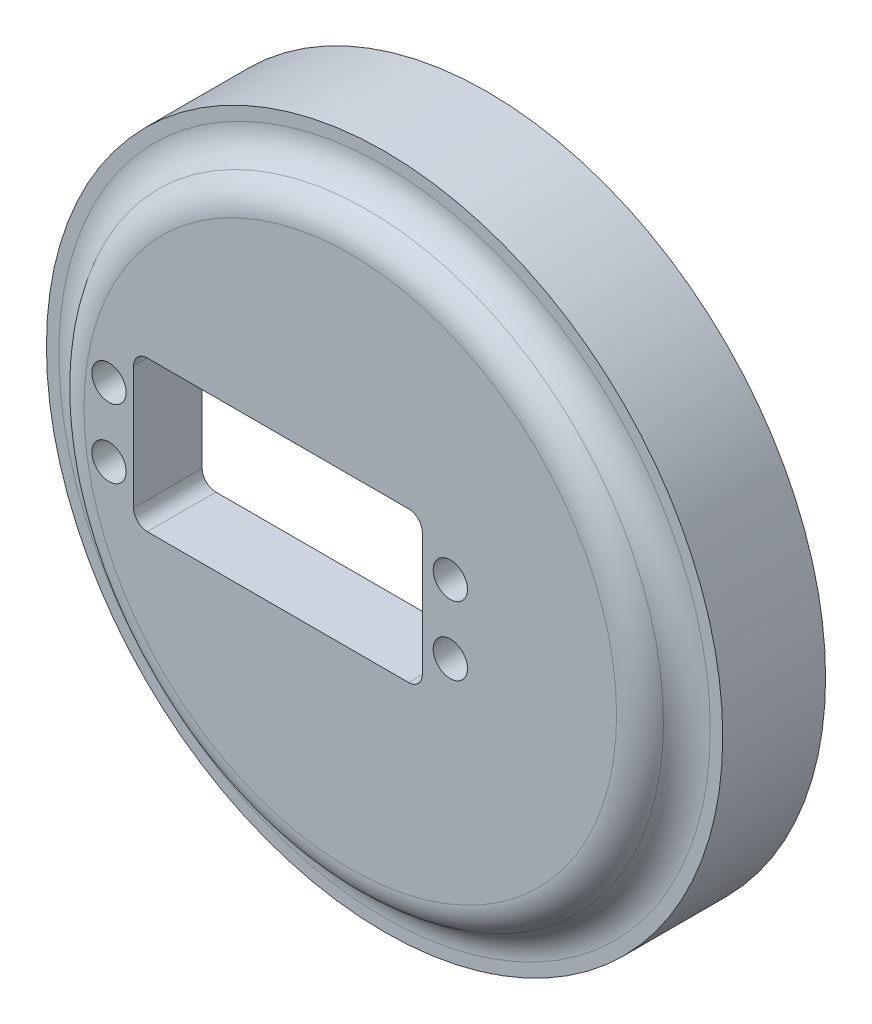
ISO-10303-21;
HEADER;
FILE_DESCRIPTION(('STEP AP214'),'2;1');
FILE_NAME('part.step','',(''),(''),'','','');
FILE_SCHEMA(('AUTOMOTIVE_DESIGN { 1 0 10303 214 1 1 1 1 }'));
ENDSEC;
DATA;
#1=APPLICATION_CONTEXT('core data for automotive mechanical design processes');
#2=APPLICATION_PROTOCOL_DEFINITION('international standard','automotive_design',2000,#1);
#3=PRODUCT_CONTEXT('',#1,'mechanical');
#4=PRODUCT('Part','Part','',(#3));
#5=PRODUCT_RELATED_PRODUCT_CATEGORY('part','',(#4));
#6=PRODUCT_DEFINITION_FORMATION('','',#4);
#7=PRODUCT_DEFINITION_CONTEXT('part definition',#1,'design');
#8=PRODUCT_DEFINITION('design','',#6,#7);
#9=PRODUCT_DEFINITION_SHAPE('','',#8);
#10=(LENGTH_UNIT() NAMED_UNIT(*) SI_UNIT(.MILLI.,.METRE.));
#11=(NAMED_UNIT(*) PLANE_ANGLE_UNIT() SI_UNIT($,.RADIAN.));
#12=(NAMED_UNIT(*) SI_UNIT($,.STERADIAN.) SOLID_ANGLE_UNIT());
#13=UNCERTAINTY_MEASURE_WITH_UNIT(LENGTH_MEASURE(1.E-05),#10,'distance_accuracy_value','');
#14=(GEOMETRIC_REPRESENTATION_CONTEXT(3) GLOBAL_UNCERTAINTY_ASSIGNED_CONTEXT((#13)) GLOBAL_UNIT_ASSIGNED_CONTEXT((#10,
#11,#12)) REPRESENTATION_CONTEXT('',''));
#15=CARTESIAN_POINT('',(0.,0.,0.));
#16=DIRECTION('',(0.,0.,1.));
#17=DIRECTION('',(1.,0.,0.));
#18=AXIS2_PLACEMENT_3D('',#15,#16,#17);
#19=CARTESIAN_POINT('',(0.,0.,0.));
#20=DIRECTION('',(0.,0.,1.));
#21=DIRECTION('',(1.,0.,0.));
#22=AXIS2_PLACEMENT_3D('',#19,#20,#21);
#23=PLANE('',#22);
#24=CARTESIAN_POINT('',(0.,0.,0.));
#25=DIRECTION('',(0.,0.,1.));
#26=DIRECTION('',(1.,0.,0.));
#27=AXIS2_PLACEMENT_3D('',#24,#25,#26);
#28=CIRCLE('',#27,49.32);
#29=CARTESIAN_POINT('',(49.32,0.,0.));
#30=VERTEX_POINT('',#29);
#31=EDGE_CURVE('E155',#30,#30,#28,.T.);
#32=ORIENTED_EDGE('',*,*,#31,.F.);
#33=EDGE_LOOP('',(#32));
#34=FACE_BOUND('',#33,.T.);
#35=CARTESIAN_POINT('',(0.,0.,0.));
#36=DIRECTION('',(0.,0.,1.));
#37=DIRECTION('',(1.,0.,0.));
#38=AXIS2_PLACEMENT_3D('',#35,#36,#37);
#39=CIRCLE('',#38,46.32);
#40=CARTESIAN_POINT('',(46.32,0.,0.));
#41=VERTEX_POINT('',#40);
#42=EDGE_CURVE('E152',#41,#41,#39,.T.);
#43=ORIENTED_EDGE('',*,*,#42,.T.);
#44=EDGE_LOOP('',(#43));
#45=FACE_BOUND('',#44,.T.);
#46=ADVANCED_FACE('F39',(#34,#45),#23,.F.);
#47=CARTESIAN_POINT('',(0.,0.,10.));
#48=DIRECTION('',(0.,0.,-1.));
#49=DIRECTION('',(-1.,0.,0.));
#50=AXIS2_PLACEMENT_3D('',#47,#48,#49);
#51=CYLINDRICAL_SURFACE('',#50,49.32);
#52=ORIENTED_EDGE('',*,*,#31,.T.);
#53=EDGE_LOOP('',(#52));
#54=FACE_BOUND('',#53,.T.);
#55=CARTESIAN_POINT('',(0.,0.,15.));
#56=DIRECTION('',(0.,0.,1.));
#57=DIRECTION('',(1.,0.,0.));
#58=AXIS2_PLACEMENT_3D('',#55,#56,#57);
#59=CIRCLE('',#58,49.32);
#60=CARTESIAN_POINT('',(49.32,0.,15.));
#61=VERTEX_POINT('',#60);
#62=EDGE_CURVE('E149',#61,#61,#59,.T.);
#63=ORIENTED_EDGE('',*,*,#62,.F.);
#64=EDGE_LOOP('',(#63));
#65=FACE_BOUND('',#64,.T.);
#66=ADVANCED_FACE('F224',(#54,#65),#51,.T.);
#67=CARTESIAN_POINT('',(0.,0.,10.));
#68=DIRECTION('',(0.,0.,-1.));
#69=DIRECTION('',(-1.,0.,0.));
#70=AXIS2_PLACEMENT_3D('',#67,#68,#69);
#71=CYLINDRICAL_SURFACE('',#70,46.32);
#72=CARTESIAN_POINT('',(0.,0.,5.));
#73=DIRECTION('',(0.,0.,1.));
#74=DIRECTION('',(1.,0.,0.));
#75=AXIS2_PLACEMENT_3D('',#72,#73,#74);
#76=CIRCLE('',#75,46.32);
#77=CARTESIAN_POINT('',(46.32,0.,5.));
#78=VERTEX_POINT('',#77);
#79=EDGE_CURVE('E161',#78,#78,#76,.T.);
#80=ORIENTED_EDGE('',*,*,#79,.T.);
#81=EDGE_LOOP('',(#80));
#82=FACE_BOUND('',#81,.T.);
#83=ORIENTED_EDGE('',*,*,#42,.F.);
#84=EDGE_LOOP('',(#83));
#85=FACE_BOUND('',#84,.T.);
#86=ADVANCED_FACE('F230',(#82,#85),#71,.F.);
#87=CARTESIAN_POINT('',(0.,0.,10.));
#88=DIRECTION('',(0.,0.,1.));
#89=DIRECTION('',(1.,0.,0.));
#90=AXIS2_PLACEMENT_3D('',#87,#88,#89);
#91=PLANE('',#90);
#92=CARTESIAN_POINT('',(-35.1896133009766,4.99999999999999,10.));
#93=DIRECTION('',(0.,0.,1.));
#94=DIRECTION('',(1.,0.,0.));
#95=AXIS2_PLACEMENT_3D('',#92,#93,#94);
#96=CIRCLE('',#95,2.5);
#97=CARTESIAN_POINT('',(-32.6896133009766,4.99999999999999,10.));
#98=VERTEX_POINT('',#97);
#99=EDGE_CURVE('E134',#98,#98,#96,.T.);
#100=ORIENTED_EDGE('',*,*,#99,.T.);
#101=EDGE_LOOP('',(#100));
#102=FACE_BOUND('',#101,.T.);
#103=CARTESIAN_POINT('',(-35.1896133009766,-5.00000000000001,10.));
#104=DIRECTION('',(0.,0.,1.));
#105=DIRECTION('',(1.,0.,0.));
#106=AXIS2_PLACEMENT_3D('',#103,#104,#105);
#107=CIRCLE('',#106,2.5);
#108=CARTESIAN_POINT('',(-32.6896133009766,-5.00000000000001,10.));
#109=VERTEX_POINT('',#108);
#110=EDGE_CURVE('E282',#109,#109,#107,.T.);
#111=ORIENTED_EDGE('',*,*,#110,.T.);
#112=EDGE_LOOP('',(#111));
#113=FACE_BOUND('',#112,.T.);
#114=CARTESIAN_POINT('',(14.5896133009771,5.00000000000001,10.));
#115=DIRECTION('',(0.,0.,1.));
#116=DIRECTION('',(1.,0.,0.));
#117=AXIS2_PLACEMENT_3D('',#114,#115,#116);
#118=CIRCLE('',#117,2.5);
#119=CARTESIAN_POINT('',(17.0896133009771,5.00000000000001,10.));
#120=VERTEX_POINT('',#119);
#121=EDGE_CURVE('E286',#120,#120,#118,.T.);
#122=ORIENTED_EDGE('',*,*,#121,.T.);
#123=EDGE_LOOP('',(#122));
#124=FACE_BOUND('',#123,.T.);
#125=CARTESIAN_POINT('',(14.5896133009771,-4.99999999999999,10.));
#126=DIRECTION('',(0.,0.,1.));
#127=DIRECTION('',(1.,0.,0.));
#128=AXIS2_PLACEMENT_3D('',#125,#126,#127);
#129=CIRCLE('',#128,2.5);
#130=CARTESIAN_POINT('',(17.0896133009771,-4.99999999999999,10.));
#131=VERTEX_POINT('',#130);
#132=EDGE_CURVE('E289',#131,#131,#129,.T.);
#133=ORIENTED_EDGE('',*,*,#132,.T.);
#134=EDGE_LOOP('',(#133));
#135=FACE_BOUND('',#134,.T.);
#136=DIRECTION('',(0.,-1.,0.));
#137=VECTOR('',#136,1.);
#138=CARTESIAN_POINT('',(-31.5999999999998,0.,10.));
#139=LINE('',#138,#137);
#140=CARTESIAN_POINT('',(-31.5999999999998,8.90000000000001,10.));
#141=VERTEX_POINT('',#140);
#142=CARTESIAN_POINT('',(-31.5999999999998,-9.03482478055817,10.));
#143=VERTEX_POINT('',#142);
#144=EDGE_CURVE('E141',#141,#143,#139,.T.);
#145=ORIENTED_EDGE('',*,*,#144,.T.);
#146=CARTESIAN_POINT('',(-29.5999999999998,-9.03482478055817,10.));
#147=DIRECTION('',(0.,0.,1.));
#148=DIRECTION('',(1.,0.,0.));
#149=AXIS2_PLACEMENT_3D('',#146,#147,#148);
#150=CIRCLE('',#149,2.);
#151=CARTESIAN_POINT('',(-29.5999999999998,-11.0348247805582,10.));
#152=VERTEX_POINT('',#151);
#153=EDGE_CURVE('E193',#143,#152,#150,.T.);
#154=ORIENTED_EDGE('',*,*,#153,.T.);
#155=DIRECTION('',(1.,0.,0.));
#156=VECTOR('',#155,1.);
#157=CARTESIAN_POINT('',(0.,-11.0348247805582,10.));
#158=LINE('',#157,#156);
#159=CARTESIAN_POINT('',(8.50000000000025,-11.0348247805582,10.));
#160=VERTEX_POINT('',#159);
#161=EDGE_CURVE('E143',#152,#160,#158,.T.);
#162=ORIENTED_EDGE('',*,*,#161,.T.);
#163=CARTESIAN_POINT('',(8.50000000000025,-9.03482478055817,10.));
#164=DIRECTION('',(0.,0.,1.));
#165=DIRECTION('',(1.,0.,0.));
#166=AXIS2_PLACEMENT_3D('',#163,#164,#165);
#167=CIRCLE('',#166,2.);
#168=CARTESIAN_POINT('',(10.5000000000002,-9.03482478055817,10.));
#169=VERTEX_POINT('',#168);
#170=EDGE_CURVE('E189',#160,#169,#167,.T.);
#171=ORIENTED_EDGE('',*,*,#170,.T.);
#172=DIRECTION('',(0.,1.,0.));
#173=VECTOR('',#172,1.);
#174=CARTESIAN_POINT('',(10.5000000000002,0.,10.));
#175=LINE('',#174,#173);
#176=CARTESIAN_POINT('',(10.5000000000002,8.90000000000001,10.));
#177=VERTEX_POINT('',#176);
#178=EDGE_CURVE('E146',#169,#177,#175,.T.);
#179=ORIENTED_EDGE('',*,*,#178,.T.);
#180=CARTESIAN_POINT('',(8.50000000000024,8.90000000000001,10.));
#181=DIRECTION('',(0.,0.,1.));
#182=DIRECTION('',(1.,0.,0.));
#183=AXIS2_PLACEMENT_3D('',#180,#181,#182);
#184=CIRCLE('',#183,2.);
#185=CARTESIAN_POINT('',(8.50000000000024,10.9,10.));
#186=VERTEX_POINT('',#185);
#187=EDGE_CURVE('E114',#177,#186,#184,.T.);
#188=ORIENTED_EDGE('',*,*,#187,.T.);
#189=DIRECTION('',(-1.,0.,0.));
#190=VECTOR('',#189,1.);
#191=CARTESIAN_POINT('',(0.,10.9,10.));
#192=LINE('',#191,#190);
#193=CARTESIAN_POINT('',(-29.5999999999998,10.9,10.));
#194=VERTEX_POINT('',#193);
#195=EDGE_CURVE('E122',#186,#194,#192,.T.);
#196=ORIENTED_EDGE('',*,*,#195,.T.);
#197=CARTESIAN_POINT('',(-29.5999999999998,8.90000000000001,10.));
#198=DIRECTION('',(0.,0.,1.));
#199=DIRECTION('',(1.,0.,0.));
#200=AXIS2_PLACEMENT_3D('',#197,#198,#199);
#201=CIRCLE('',#200,2.);
#202=EDGE_CURVE('E12',#194,#141,#201,.T.);
#203=ORIENTED_EDGE('',*,*,#202,.T.);
#204=EDGE_LOOP('',(#145,#154,#162,#171,#179,#188,#196,#203));
#205=FACE_BOUND('',#204,.T.);
#206=CARTESIAN_POINT('',(0.,0.,10.));
#207=DIRECTION('',(0.,0.,1.));
#208=DIRECTION('',(1.,0.,0.));
#209=AXIS2_PLACEMENT_3D('',#206,#207,#208);
#210=CIRCLE('',#209,41.32);
#211=CARTESIAN_POINT('',(41.32,0.,10.));
#212=VERTEX_POINT('',#211);
#213=EDGE_CURVE('E164',#212,#212,#210,.F.);
#214=ORIENTED_EDGE('',*,*,#213,.T.);
#215=EDGE_LOOP('',(#214));
#216=FACE_BOUND('',#215,.T.);
#217=ADVANCED_FACE('F196',(#102,#113,#124,#135,#205,#216),#91,.F.);
#218=CARTESIAN_POINT('',(0.,0.,15.));
#219=DIRECTION('',(0.,0.,1.));
#220=DIRECTION('',(1.,0.,0.));
#221=AXIS2_PLACEMENT_3D('',#218,#219,#220);
#222=PLANE('',#221);
#223=CARTESIAN_POINT('',(0.,0.,15.));
#224=DIRECTION('',(0.,0.,1.));
#225=DIRECTION('',(1.,0.,0.));
#226=AXIS2_PLACEMENT_3D('',#223,#224,#225);
#227=CIRCLE('',#226,47.5);
#228=CARTESIAN_POINT('',(47.5,0.,15.));
#229=VERTEX_POINT('',#228);
#230=EDGE_CURVE('E158',#229,#229,#227,.F.);
#231=ORIENTED_EDGE('',*,*,#230,.T.);
#232=EDGE_LOOP('',(#231));
#233=FACE_BOUND('',#232,.T.);
#234=ORIENTED_EDGE('',*,*,#62,.T.);
#235=EDGE_LOOP('',(#234));
#236=FACE_BOUND('',#235,.T.);
#237=ADVANCED_FACE('F257',(#233,#236),#222,.T.);
#238=CARTESIAN_POINT('',(0.,0.,20.));
#239=DIRECTION('',(0.,0.,1.));
#240=DIRECTION('',(1.,0.,0.));
#241=AXIS2_PLACEMENT_3D('',#238,#239,#240);
#242=PLANE('',#241);
#243=CARTESIAN_POINT('',(-35.1896133009766,4.99999999999999,20.));
#244=DIRECTION('',(0.,0.,1.));
#245=DIRECTION('',(1.,0.,0.));
#246=AXIS2_PLACEMENT_3D('',#243,#244,#245);
#247=CIRCLE('',#246,2.5);
#248=CARTESIAN_POINT('',(-32.6896133009766,4.99999999999999,20.));
#249=VERTEX_POINT('',#248);
#250=EDGE_CURVE('E291',#249,#249,#247,.T.);
#251=ORIENTED_EDGE('',*,*,#250,.F.);
#252=EDGE_LOOP('',(#251));
#253=FACE_BOUND('',#252,.T.);
#254=CARTESIAN_POINT('',(-35.1896133009766,-5.00000000000001,20.));
#255=DIRECTION('',(0.,0.,1.));
#256=DIRECTION('',(1.,0.,0.));
#257=AXIS2_PLACEMENT_3D('',#254,#255,#256);
#258=CIRCLE('',#257,2.5);
#259=CARTESIAN_POINT('',(-32.6896133009766,-5.00000000000001,20.));
#260=VERTEX_POINT('',#259);
#261=EDGE_CURVE('E295',#260,#260,#258,.T.);
#262=ORIENTED_EDGE('',*,*,#261,.F.);
#263=EDGE_LOOP('',(#262));
#264=FACE_BOUND('',#263,.T.);
#265=CARTESIAN_POINT('',(14.5896133009771,5.00000000000001,20.));
#266=DIRECTION('',(0.,0.,1.));
#267=DIRECTION('',(1.,0.,0.));
#268=AXIS2_PLACEMENT_3D('',#265,#266,#267);
#269=CIRCLE('',#268,2.5);
#270=CARTESIAN_POINT('',(17.0896133009771,5.00000000000001,20.));
#271=VERTEX_POINT('',#270);
#272=EDGE_CURVE('E302',#271,#271,#269,.T.);
#273=ORIENTED_EDGE('',*,*,#272,.F.);
#274=EDGE_LOOP('',(#273));
#275=FACE_BOUND('',#274,.T.);
#276=CARTESIAN_POINT('',(14.5896133009771,-4.99999999999999,20.));
#277=DIRECTION('',(0.,0.,1.));
#278=DIRECTION('',(1.,0.,0.));
#279=AXIS2_PLACEMENT_3D('',#276,#277,#278);
#280=CIRCLE('',#279,2.5);
#281=CARTESIAN_POINT('',(17.0896133009771,-4.99999999999999,20.));
#282=VERTEX_POINT('',#281);
#283=EDGE_CURVE('E298',#282,#282,#280,.T.);
#284=ORIENTED_EDGE('',*,*,#283,.F.);
#285=EDGE_LOOP('',(#284));
#286=FACE_BOUND('',#285,.T.);
#287=DIRECTION('',(0.,1.,0.));
#288=VECTOR('',#287,1.);
#289=CARTESIAN_POINT('',(10.5000000000002,10.9,20.));
#290=LINE('',#289,#288);
#291=CARTESIAN_POINT('',(10.5000000000002,-9.03482478055816,20.));
#292=VERTEX_POINT('',#291);
#293=CARTESIAN_POINT('',(10.5000000000002,8.90000000000001,20.));
#294=VERTEX_POINT('',#293);
#295=EDGE_CURVE('E130',#292,#294,#290,.T.);
#296=ORIENTED_EDGE('',*,*,#295,.F.);
#297=CARTESIAN_POINT('',(8.50000000000025,-9.03482478055817,20.));
#298=DIRECTION('',(0.,0.,1.));
#299=DIRECTION('',(1.,0.,0.));
#300=AXIS2_PLACEMENT_3D('',#297,#298,#299);
#301=CIRCLE('',#300,2.);
#302=CARTESIAN_POINT('',(8.50000000000024,-11.0348247805582,20.));
#303=VERTEX_POINT('',#302);
#304=EDGE_CURVE('E187',#292,#303,#301,.F.);
#305=ORIENTED_EDGE('',*,*,#304,.T.);
#306=DIRECTION('',(1.,0.,0.));
#307=VECTOR('',#306,1.);
#308=CARTESIAN_POINT('',(-31.5999999999998,-11.0348247805582,20.));
#309=LINE('',#308,#307);
#310=CARTESIAN_POINT('',(-29.5999999999998,-11.0348247805582,20.));
#311=VERTEX_POINT('',#310);
#312=EDGE_CURVE('E132',#311,#303,#309,.T.);
#313=ORIENTED_EDGE('',*,*,#312,.F.);
#314=CARTESIAN_POINT('',(-29.5999999999998,-9.03482478055817,20.));
#315=DIRECTION('',(0.,0.,1.));
#316=DIRECTION('',(1.,0.,0.));
#317=AXIS2_PLACEMENT_3D('',#314,#315,#316);
#318=CIRCLE('',#317,2.);
#319=CARTESIAN_POINT('',(-31.5999999999998,-9.03482478055816,20.));
#320=VERTEX_POINT('',#319);
#321=EDGE_CURVE('E191',#311,#320,#318,.F.);
#322=ORIENTED_EDGE('',*,*,#321,.T.);
#323=DIRECTION('',(0.,-1.,0.));
#324=VECTOR('',#323,1.);
#325=CARTESIAN_POINT('',(-31.5999999999998,10.9,20.));
#326=LINE('',#325,#324);
#327=CARTESIAN_POINT('',(-31.5999999999998,8.90000000000001,20.));
#328=VERTEX_POINT('',#327);
#329=EDGE_CURVE('E129',#328,#320,#326,.T.);
#330=ORIENTED_EDGE('',*,*,#329,.F.);
#331=CARTESIAN_POINT('',(-29.5999999999998,8.90000000000001,20.));
#332=DIRECTION('',(0.,0.,1.));
#333=DIRECTION('',(1.,0.,0.));
#334=AXIS2_PLACEMENT_3D('',#331,#332,#333);
#335=CIRCLE('',#334,2.);
#336=CARTESIAN_POINT('',(-29.5999999999998,10.9,20.));
#337=VERTEX_POINT('',#336);
#338=EDGE_CURVE('E47',#328,#337,#335,.F.);
#339=ORIENTED_EDGE('',*,*,#338,.T.);
#340=DIRECTION('',(-1.,0.,0.));
#341=VECTOR('',#340,1.);
#342=CARTESIAN_POINT('',(-31.5999999999998,10.9,20.));
#343=LINE('',#342,#341);
#344=CARTESIAN_POINT('',(8.50000000000024,10.9,20.));
#345=VERTEX_POINT('',#344);
#346=EDGE_CURVE('E120',#345,#337,#343,.T.);
#347=ORIENTED_EDGE('',*,*,#346,.F.);
#348=CARTESIAN_POINT('',(8.50000000000024,8.90000000000001,20.));
#349=DIRECTION('',(0.,0.,1.));
#350=DIRECTION('',(1.,0.,0.));
#351=AXIS2_PLACEMENT_3D('',#348,#349,#350);
#352=CIRCLE('',#351,2.);
#353=EDGE_CURVE('E104',#345,#294,#352,.F.);
#354=ORIENTED_EDGE('',*,*,#353,.T.);
#355=EDGE_LOOP('',(#296,#305,#313,#322,#330,#339,#347,#354));
#356=FACE_BOUND('',#355,.T.);
#357=CARTESIAN_POINT('',(0.,0.,20.));
#358=DIRECTION('',(0.,0.,1.));
#359=DIRECTION('',(1.,0.,0.));
#360=AXIS2_PLACEMENT_3D('',#357,#358,#359);
#361=CIRCLE('',#360,38.8397459621556);
#362=CARTESIAN_POINT('',(38.8397459621556,0.,20.));
#363=VERTEX_POINT('',#362);
#364=EDGE_CURVE('E167',#363,#363,#361,.T.);
#365=ORIENTED_EDGE('',*,*,#364,.T.);
#366=EDGE_LOOP('',(#365));
#367=FACE_BOUND('',#366,.T.);
#368=ADVANCED_FACE('F126',(#253,#264,#275,#286,#356,#367),#242,.T.);
#369=CARTESIAN_POINT('',(0.,0.,20.));
#370=DIRECTION('',(0.,0.,1.));
#371=DIRECTION('',(1.,0.,0.));
#372=AXIS2_PLACEMENT_3D('',#369,#370,#371);
#373=TOROIDAL_SURFACE('',#372,47.5,5.);
#374=CARTESIAN_POINT('',(0.,0.,17.5));
#375=DIRECTION('',(0.,0.,1.));
#376=DIRECTION('',(1.,0.,0.));
#377=AXIS2_PLACEMENT_3D('',#374,#375,#376);
#378=CIRCLE('',#377,43.1698729810778);
#379=CARTESIAN_POINT('',(43.1698729810778,0.,17.5));
#380=VERTEX_POINT('',#379);
#381=EDGE_CURVE('E170',#380,#380,#378,.F.);
#382=ORIENTED_EDGE('',*,*,#381,.T.);
#383=EDGE_LOOP('',(#382));
#384=FACE_BOUND('',#383,.T.);
#385=ORIENTED_EDGE('',*,*,#230,.F.);
#386=EDGE_LOOP('',(#385));
#387=FACE_BOUND('',#386,.T.);
#388=ADVANCED_FACE('F238',(#384,#387),#373,.F.);
#389=CARTESIAN_POINT('',(0.,0.,5.));
#390=DIRECTION('',(0.,0.,1.));
#391=DIRECTION('',(1.,0.,0.));
#392=AXIS2_PLACEMENT_3D('',#389,#390,#391);
#393=TOROIDAL_SURFACE('',#392,41.32,5.);
#394=ORIENTED_EDGE('',*,*,#213,.F.);
#395=EDGE_LOOP('',(#394));
#396=FACE_BOUND('',#395,.T.);
#397=ORIENTED_EDGE('',*,*,#79,.F.);
#398=EDGE_LOOP('',(#397));
#399=FACE_BOUND('',#398,.T.);
#400=ADVANCED_FACE('F241',(#396,#399),#393,.F.);
#401=CARTESIAN_POINT('',(0.,0.,15.));
#402=DIRECTION('',(0.,0.,-1.));
#403=DIRECTION('',(-1.,0.,0.));
#404=AXIS2_PLACEMENT_3D('',#401,#402,#403);
#405=TOROIDAL_SURFACE('',#404,38.8397459621556,5.);
#406=ORIENTED_EDGE('',*,*,#381,.F.);
#407=EDGE_LOOP('',(#406));
#408=FACE_BOUND('',#407,.T.);
#409=ORIENTED_EDGE('',*,*,#364,.F.);
#410=EDGE_LOOP('',(#409));
#411=FACE_BOUND('',#410,.T.);
#412=ADVANCED_FACE('F245',(#408,#411),#405,.T.);
#413=CARTESIAN_POINT('',(10.5000000000002,10.9,0.));
#414=DIRECTION('',(1.,0.,0.));
#415=DIRECTION('',(0.,0.,-1.));
#416=AXIS2_PLACEMENT_3D('',#413,#414,#415);
#417=PLANE('',#416);
#418=ORIENTED_EDGE('',*,*,#295,.T.);
#419=DIRECTION('',(0.,0.,1.));
#420=VECTOR('',#419,1.);
#421=CARTESIAN_POINT('',(10.5000000000002,8.90000000000001,10.));
#422=LINE('',#421,#420);
#423=EDGE_CURVE('E109',#294,#177,#422,.F.);
#424=ORIENTED_EDGE('',*,*,#423,.T.);
#425=ORIENTED_EDGE('',*,*,#178,.F.);
#426=DIRECTION('',(0.,0.,1.));
#427=VECTOR('',#426,1.);
#428=CARTESIAN_POINT('',(10.5000000000002,-9.03482478055817,20.));
#429=LINE('',#428,#427);
#430=EDGE_CURVE('E123',#169,#292,#429,.T.);
#431=ORIENTED_EDGE('',*,*,#430,.T.);
#432=EDGE_LOOP('',(#418,#424,#425,#431));
#433=FACE_BOUND('',#432,.T.);
#434=ADVANCED_FACE('F212',(#433),#417,.F.);
#435=CARTESIAN_POINT('',(-31.5999999999998,-11.0348247805582,0.));
#436=DIRECTION('',(0.,-1.,0.));
#437=DIRECTION('',(0.,0.,-1.));
#438=AXIS2_PLACEMENT_3D('',#435,#436,#437);
#439=PLANE('',#438);
#440=ORIENTED_EDGE('',*,*,#312,.T.);
#441=DIRECTION('',(0.,0.,1.));
#442=VECTOR('',#441,1.);
#443=CARTESIAN_POINT('',(8.50000000000025,-11.0348247805582,10.));
#444=LINE('',#443,#442);
#445=EDGE_CURVE('E180',#303,#160,#444,.F.);
#446=ORIENTED_EDGE('',*,*,#445,.T.);
#447=ORIENTED_EDGE('',*,*,#161,.F.);
#448=DIRECTION('',(0.,0.,1.));
#449=VECTOR('',#448,1.);
#450=CARTESIAN_POINT('',(-29.5999999999998,-11.0348247805582,20.));
#451=LINE('',#450,#449);
#452=EDGE_CURVE('E177',#152,#311,#451,.T.);
#453=ORIENTED_EDGE('',*,*,#452,.T.);
#454=EDGE_LOOP('',(#440,#446,#447,#453));
#455=FACE_BOUND('',#454,.T.);
#456=ADVANCED_FACE('F202',(#455),#439,.F.);
#457=CARTESIAN_POINT('',(-31.5999999999998,10.9,0.));
#458=DIRECTION('',(-1.,0.,0.));
#459=DIRECTION('',(0.,0.,1.));
#460=AXIS2_PLACEMENT_3D('',#457,#458,#459);
#461=PLANE('',#460);
#462=ORIENTED_EDGE('',*,*,#329,.T.);
#463=DIRECTION('',(0.,0.,1.));
#464=VECTOR('',#463,1.);
#465=CARTESIAN_POINT('',(-31.5999999999998,-9.03482478055817,10.));
#466=LINE('',#465,#464);
#467=EDGE_CURVE('E54',#320,#143,#466,.F.);
#468=ORIENTED_EDGE('',*,*,#467,.T.);
#469=ORIENTED_EDGE('',*,*,#144,.F.);
#470=DIRECTION('',(0.,0.,1.));
#471=VECTOR('',#470,1.);
#472=CARTESIAN_POINT('',(-31.5999999999998,8.90000000000001,20.));
#473=LINE('',#472,#471);
#474=EDGE_CURVE('E182',#141,#328,#473,.T.);
#475=ORIENTED_EDGE('',*,*,#474,.T.);
#476=EDGE_LOOP('',(#462,#468,#469,#475));
#477=FACE_BOUND('',#476,.T.);
#478=ADVANCED_FACE('F206',(#477),#461,.F.);
#479=CARTESIAN_POINT('',(-31.5999999999998,10.9,0.));
#480=DIRECTION('',(0.,1.,0.));
#481=DIRECTION('',(0.,0.,1.));
#482=AXIS2_PLACEMENT_3D('',#479,#480,#481);
#483=PLANE('',#482);
#484=ORIENTED_EDGE('',*,*,#195,.F.);
#485=DIRECTION('',(0.,0.,1.));
#486=VECTOR('',#485,1.);
#487=CARTESIAN_POINT('',(8.50000000000024,10.9,20.));
#488=LINE('',#487,#486);
#489=EDGE_CURVE('E108',#186,#345,#488,.T.);
#490=ORIENTED_EDGE('',*,*,#489,.T.);
#491=ORIENTED_EDGE('',*,*,#346,.T.);
#492=DIRECTION('',(0.,0.,1.));
#493=VECTOR('',#492,1.);
#494=CARTESIAN_POINT('',(-29.5999999999998,10.9,10.));
#495=LINE('',#494,#493);
#496=EDGE_CURVE('E124',#337,#194,#495,.F.);
#497=ORIENTED_EDGE('',*,*,#496,.T.);
#498=EDGE_LOOP('',(#484,#490,#491,#497));
#499=FACE_BOUND('',#498,.T.);
#500=ADVANCED_FACE('F119',(#499),#483,.F.);
#501=CARTESIAN_POINT('',(14.5896133009771,-4.99999999999999,0.));
#502=DIRECTION('',(0.,0.,1.));
#503=DIRECTION('',(1.,0.,0.));
#504=AXIS2_PLACEMENT_3D('',#501,#502,#503);
#505=CYLINDRICAL_SURFACE('',#504,2.5);
#506=ORIENTED_EDGE('',*,*,#283,.T.);
#507=EDGE_LOOP('',(#506));
#508=FACE_BOUND('',#507,.T.);
#509=ORIENTED_EDGE('',*,*,#132,.F.);
#510=EDGE_LOOP('',(#509));
#511=FACE_BOUND('',#510,.T.);
#512=ADVANCED_FACE('F315',(#508,#511),#505,.F.);
#513=CARTESIAN_POINT('',(14.5896133009771,5.00000000000001,0.));
#514=DIRECTION('',(0.,0.,1.));
#515=DIRECTION('',(1.,0.,0.));
#516=AXIS2_PLACEMENT_3D('',#513,#514,#515);
#517=CYLINDRICAL_SURFACE('',#516,2.5);
#518=ORIENTED_EDGE('',*,*,#272,.T.);
#519=EDGE_LOOP('',(#518));
#520=FACE_BOUND('',#519,.T.);
#521=ORIENTED_EDGE('',*,*,#121,.F.);
#522=EDGE_LOOP('',(#521));
#523=FACE_BOUND('',#522,.T.);
#524=ADVANCED_FACE('F317',(#520,#523),#517,.F.);
#525=CARTESIAN_POINT('',(-35.1896133009766,-5.00000000000001,0.));
#526=DIRECTION('',(0.,0.,1.));
#527=DIRECTION('',(1.,0.,0.));
#528=AXIS2_PLACEMENT_3D('',#525,#526,#527);
#529=CYLINDRICAL_SURFACE('',#528,2.5);
#530=ORIENTED_EDGE('',*,*,#261,.T.);
#531=EDGE_LOOP('',(#530));
#532=FACE_BOUND('',#531,.T.);
#533=ORIENTED_EDGE('',*,*,#110,.F.);
#534=EDGE_LOOP('',(#533));
#535=FACE_BOUND('',#534,.T.);
#536=ADVANCED_FACE('F308',(#532,#535),#529,.F.);
#537=CARTESIAN_POINT('',(-35.1896133009766,4.99999999999999,0.));
#538=DIRECTION('',(0.,0.,1.));
#539=DIRECTION('',(1.,0.,0.));
#540=AXIS2_PLACEMENT_3D('',#537,#538,#539);
#541=CYLINDRICAL_SURFACE('',#540,2.5);
#542=ORIENTED_EDGE('',*,*,#250,.T.);
#543=EDGE_LOOP('',(#542));
#544=FACE_BOUND('',#543,.T.);
#545=ORIENTED_EDGE('',*,*,#99,.F.);
#546=EDGE_LOOP('',(#545));
#547=FACE_BOUND('',#546,.T.);
#548=ADVANCED_FACE('F221',(#544,#547),#541,.F.);
#549=CARTESIAN_POINT('',(8.50000000000024,8.90000000000001,0.));
#550=DIRECTION('',(0.,0.,-1.));
#551=DIRECTION('',(-1.,0.,0.));
#552=AXIS2_PLACEMENT_3D('',#549,#550,#551);
#553=CYLINDRICAL_SURFACE('',#552,2.);
#554=ORIENTED_EDGE('',*,*,#187,.F.);
#555=ORIENTED_EDGE('',*,*,#423,.F.);
#556=ORIENTED_EDGE('',*,*,#353,.F.);
#557=ORIENTED_EDGE('',*,*,#489,.F.);
#558=EDGE_LOOP('',(#554,#555,#556,#557));
#559=FACE_BOUND('',#558,.T.);
#560=ADVANCED_FACE('F107',(#559),#553,.F.);
#561=CARTESIAN_POINT('',(8.50000000000025,-9.03482478055817,0.));
#562=DIRECTION('',(0.,0.,-1.));
#563=DIRECTION('',(-1.,0.,0.));
#564=AXIS2_PLACEMENT_3D('',#561,#562,#563);
#565=CYLINDRICAL_SURFACE('',#564,2.);
#566=ORIENTED_EDGE('',*,*,#170,.F.);
#567=ORIENTED_EDGE('',*,*,#445,.F.);
#568=ORIENTED_EDGE('',*,*,#304,.F.);
#569=ORIENTED_EDGE('',*,*,#430,.F.);
#570=EDGE_LOOP('',(#566,#567,#568,#569));
#571=FACE_BOUND('',#570,.T.);
#572=ADVANCED_FACE('F214',(#571),#565,.F.);
#573=CARTESIAN_POINT('',(-29.5999999999998,-9.03482478055817,0.));
#574=DIRECTION('',(0.,0.,-1.));
#575=DIRECTION('',(-1.,0.,0.));
#576=AXIS2_PLACEMENT_3D('',#573,#574,#575);
#577=CYLINDRICAL_SURFACE('',#576,2.);
#578=ORIENTED_EDGE('',*,*,#153,.F.);
#579=ORIENTED_EDGE('',*,*,#467,.F.);
#580=ORIENTED_EDGE('',*,*,#321,.F.);
#581=ORIENTED_EDGE('',*,*,#452,.F.);
#582=EDGE_LOOP('',(#578,#579,#580,#581));
#583=FACE_BOUND('',#582,.T.);
#584=ADVANCED_FACE('F205',(#583),#577,.F.);
#585=CARTESIAN_POINT('',(-29.5999999999998,8.90000000000001,0.));
#586=DIRECTION('',(0.,0.,-1.));
#587=DIRECTION('',(-1.,0.,0.));
#588=AXIS2_PLACEMENT_3D('',#585,#586,#587);
#589=CYLINDRICAL_SURFACE('',#588,2.);
#590=ORIENTED_EDGE('',*,*,#202,.F.);
#591=ORIENTED_EDGE('',*,*,#496,.F.);
#592=ORIENTED_EDGE('',*,*,#338,.F.);
#593=ORIENTED_EDGE('',*,*,#474,.F.);
#594=EDGE_LOOP('',(#590,#591,#592,#593));
#595=FACE_BOUND('',#594,.T.);
#596=ADVANCED_FACE('F41',(#595),#589,.F.);
#597=CLOSED_SHELL('',(#46,#66,#86,#217,#237,#368,#388,#400,#412,#434,#456,#478,#500,#512,#524,
#536,#548,#560,#572,#584,#596));
#598=MANIFOLD_SOLID_BREP('B2',#597);
#599=ADVANCED_BREP_SHAPE_REPRESENTATION('',(#18,#598),#14);
#600=SHAPE_DEFINITION_REPRESENTATION(#9,#599);
ENDSEC;
END-ISO-10303-21;
